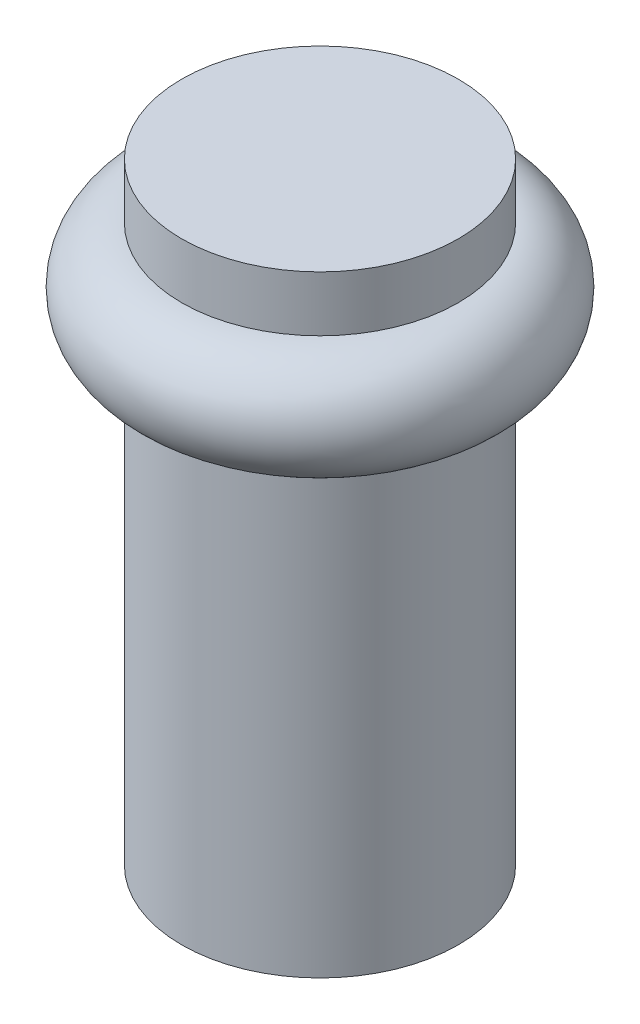
ISO-10303-21;
HEADER;
FILE_DESCRIPTION(('STEP AP214'),'2;1');
FILE_NAME('part.step','',(''),(''),'','','');
FILE_SCHEMA(('AUTOMOTIVE_DESIGN { 1 0 10303 214 1 1 1 1 }'));
ENDSEC;
DATA;
#1=APPLICATION_CONTEXT('core data for automotive mechanical design processes');
#2=APPLICATION_PROTOCOL_DEFINITION('international standard','automotive_design',2000,#1);
#3=PRODUCT_CONTEXT('',#1,'mechanical');
#4=PRODUCT('Part','Part','',(#3));
#5=PRODUCT_RELATED_PRODUCT_CATEGORY('part','',(#4));
#6=PRODUCT_DEFINITION_FORMATION('','',#4);
#7=PRODUCT_DEFINITION_CONTEXT('part definition',#1,'design');
#8=PRODUCT_DEFINITION('design','',#6,#7);
#9=PRODUCT_DEFINITION_SHAPE('','',#8);
#10=(LENGTH_UNIT() NAMED_UNIT(*) SI_UNIT(.MILLI.,.METRE.));
#11=(NAMED_UNIT(*) PLANE_ANGLE_UNIT() SI_UNIT($,.RADIAN.));
#12=(NAMED_UNIT(*) SI_UNIT($,.STERADIAN.) SOLID_ANGLE_UNIT());
#13=UNCERTAINTY_MEASURE_WITH_UNIT(LENGTH_MEASURE(1.E-05),#10,'distance_accuracy_value','');
#14=(GEOMETRIC_REPRESENTATION_CONTEXT(3) GLOBAL_UNCERTAINTY_ASSIGNED_CONTEXT((#13)) GLOBAL_UNIT_ASSIGNED_CONTEXT((#10,
#11,#12)) REPRESENTATION_CONTEXT('',''));
#15=CARTESIAN_POINT('',(0.,0.,0.));
#16=DIRECTION('',(0.,0.,1.));
#17=DIRECTION('',(1.,0.,0.));
#18=AXIS2_PLACEMENT_3D('',#15,#16,#17);
#19=CARTESIAN_POINT('',(0.,-1105.,0.));
#20=DIRECTION('',(0.,-1.,0.));
#21=DIRECTION('',(0.,0.,-1.));
#22=AXIS2_PLACEMENT_3D('',#19,#20,#21);
#23=PLANE('',#22);
#24=CARTESIAN_POINT('',(0.,-1105.,0.));
#25=DIRECTION('',(0.,-1.,0.));
#26=DIRECTION('',(1.,0.,0.));
#27=AXIS2_PLACEMENT_3D('',#24,#25,#26);
#28=CIRCLE('',#27,250.);
#29=CARTESIAN_POINT('',(-250.,-1105.,0.));
#30=VERTEX_POINT('',#29);
#31=EDGE_CURVE('E27',#30,#30,#28,.T.);
#32=ORIENTED_EDGE('',*,*,#31,.T.);
#33=EDGE_LOOP('',(#32));
#34=FACE_BOUND('',#33,.T.);
#35=ADVANCED_FACE('F17',(#34),#23,.T.);
#36=CARTESIAN_POINT('',(0.,-702.5,0.));
#37=DIRECTION('',(0.,-1.,0.));
#38=DIRECTION('',(1.,0.,0.));
#39=AXIS2_PLACEMENT_3D('',#36,#37,#38);
#40=CYLINDRICAL_SURFACE('',#39,250.);
#41=ORIENTED_EDGE('',*,*,#31,.F.);
#42=DIRECTION('',(0.,1.,0.));
#43=VECTOR('',#42,1.);
#44=CARTESIAN_POINT('',(-250.,-702.5,0.));
#45=LINE('',#44,#43);
#46=CARTESIAN_POINT('',(-250.,-300.,0.));
#47=VERTEX_POINT('',#46);
#48=EDGE_CURVE('E11',#30,#47,#45,.T.);
#49=ORIENTED_EDGE('',*,*,#48,.T.);
#50=CARTESIAN_POINT('',(0.,-300.,0.));
#51=DIRECTION('',(0.,-1.,0.));
#52=DIRECTION('',(1.,0.,0.));
#53=AXIS2_PLACEMENT_3D('',#50,#51,#52);
#54=CIRCLE('',#53,250.);
#55=CARTESIAN_POINT('',(0.,-300.,250.));
#56=VERTEX_POINT('',#55);
#57=EDGE_CURVE('E75',#47,#56,#54,.T.);
#58=ORIENTED_EDGE('',*,*,#57,.T.);
#59=CARTESIAN_POINT('',(0.,-300.,0.));
#60=DIRECTION('',(0.,-1.,0.));
#61=DIRECTION('',(1.,0.,0.));
#62=AXIS2_PLACEMENT_3D('',#59,#60,#61);
#63=CIRCLE('',#62,250.);
#64=EDGE_CURVE('E79',#56,#47,#63,.T.);
#65=ORIENTED_EDGE('',*,*,#64,.T.);
#66=ORIENTED_EDGE('',*,*,#48,.F.);
#67=EDGE_LOOP('',(#41,#49,#58,#65,#66));
#68=FACE_BOUND('',#67,.T.);
#69=ADVANCED_FACE('F19',(#68),#40,.T.);
#70=CARTESIAN_POINT('',(0.,-200.,0.));
#71=DIRECTION('',(0.,-1.,0.));
#72=DIRECTION('',(0.,0.,-1.));
#73=AXIS2_PLACEMENT_3D('',#70,#71,#72);
#74=TOROIDAL_SURFACE('',#73,250.,100.);
#75=ORIENTED_EDGE('',*,*,#57,.F.);
#76=ORIENTED_EDGE('',*,*,#64,.F.);
#77=CARTESIAN_POINT('',(0.,-200.,250.));
#78=DIRECTION('',(-1.,0.,0.));
#79=DIRECTION('',(0.,0.,1.));
#80=AXIS2_PLACEMENT_3D('',#77,#78,#79);
#81=CIRCLE('',#80,100.);
#82=CARTESIAN_POINT('',(0.,-100.,250.));
#83=VERTEX_POINT('',#82);
#84=EDGE_CURVE('E82',#56,#83,#81,.T.);
#85=ORIENTED_EDGE('',*,*,#84,.T.);
#86=CARTESIAN_POINT('',(0.,-100.,0.));
#87=DIRECTION('',(0.,-1.,0.));
#88=DIRECTION('',(1.,0.,0.));
#89=AXIS2_PLACEMENT_3D('',#86,#87,#88);
#90=CIRCLE('',#89,250.);
#91=CARTESIAN_POINT('',(-250.,-100.,0.));
#92=VERTEX_POINT('',#91);
#93=EDGE_CURVE('E55',#83,#92,#90,.T.);
#94=ORIENTED_EDGE('',*,*,#93,.T.);
#95=CARTESIAN_POINT('',(0.,-100.,0.));
#96=DIRECTION('',(0.,-1.,0.));
#97=DIRECTION('',(1.,0.,0.));
#98=AXIS2_PLACEMENT_3D('',#95,#96,#97);
#99=CIRCLE('',#98,250.);
#100=EDGE_CURVE('E67',#92,#83,#99,.T.);
#101=ORIENTED_EDGE('',*,*,#100,.T.);
#102=ORIENTED_EDGE('',*,*,#84,.F.);
#103=EDGE_LOOP('',(#75,#76,#85,#94,#101,#102));
#104=FACE_BOUND('',#103,.T.);
#105=ADVANCED_FACE('F95',(#104),#74,.T.);
#106=CARTESIAN_POINT('',(0.,-50.,0.));
#107=DIRECTION('',(0.,-1.,0.));
#108=DIRECTION('',(1.,0.,0.));
#109=AXIS2_PLACEMENT_3D('',#106,#107,#108);
#110=CYLINDRICAL_SURFACE('',#109,250.);
#111=ORIENTED_EDGE('',*,*,#100,.F.);
#112=DIRECTION('',(0.,1.,0.));
#113=VECTOR('',#112,1.);
#114=CARTESIAN_POINT('',(-250.,-50.,0.));
#115=LINE('',#114,#113);
#116=CARTESIAN_POINT('',(-250.,0.,0.));
#117=VERTEX_POINT('',#116);
#118=EDGE_CURVE('E63',#92,#117,#115,.T.);
#119=ORIENTED_EDGE('',*,*,#118,.T.);
#120=CARTESIAN_POINT('',(0.,0.,0.));
#121=DIRECTION('',(0.,-1.,0.));
#122=DIRECTION('',(1.,0.,0.));
#123=AXIS2_PLACEMENT_3D('',#120,#121,#122);
#124=CIRCLE('',#123,250.);
#125=EDGE_CURVE('E66',#117,#117,#124,.T.);
#126=ORIENTED_EDGE('',*,*,#125,.T.);
#127=ORIENTED_EDGE('',*,*,#118,.F.);
#128=ORIENTED_EDGE('',*,*,#93,.F.);
#129=EDGE_LOOP('',(#111,#119,#126,#127,#128));
#130=FACE_BOUND('',#129,.T.);
#131=ADVANCED_FACE('F64',(#130),#110,.T.);
#132=CARTESIAN_POINT('',(250.,0.,0.));
#133=DIRECTION('',(0.,1.,0.));
#134=DIRECTION('',(1.,0.,0.));
#135=AXIS2_PLACEMENT_3D('',#132,#133,#134);
#136=PLANE('',#135);
#137=ORIENTED_EDGE('',*,*,#125,.F.);
#138=EDGE_LOOP('',(#137));
#139=FACE_BOUND('',#138,.T.);
#140=ADVANCED_FACE('F103',(#139),#136,.T.);
#141=CLOSED_SHELL('',(#35,#69,#105,#131,#140));
#142=MANIFOLD_SOLID_BREP('B1',#141);
#143=ADVANCED_BREP_SHAPE_REPRESENTATION('',(#18,#142),#14);
#144=SHAPE_DEFINITION_REPRESENTATION(#9,#143);
ENDSEC;
END-ISO-10303-21;
